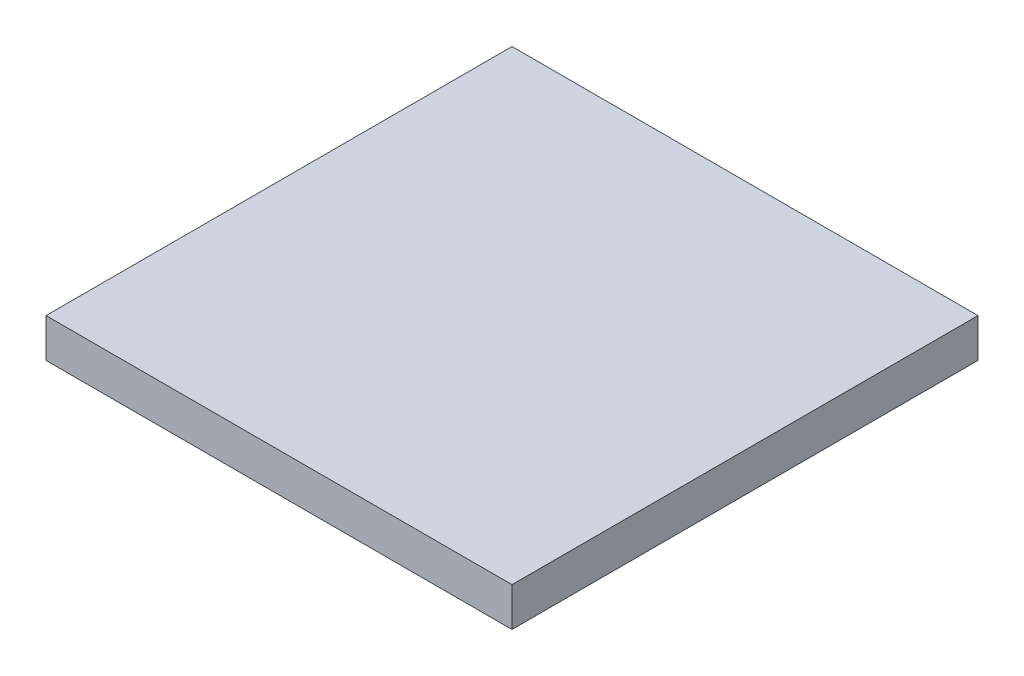
ISO-10303-21;
HEADER;
FILE_DESCRIPTION(('STEP AP214'),'2;1');
FILE_NAME('part.step','',(''),(''),'','','');
FILE_SCHEMA(('AUTOMOTIVE_DESIGN { 1 0 10303 214 1 1 1 1 }'));
ENDSEC;
DATA;
#1=APPLICATION_CONTEXT('core data for automotive mechanical design processes');
#2=APPLICATION_PROTOCOL_DEFINITION('international standard','automotive_design',2000,#1);
#3=PRODUCT_CONTEXT('',#1,'mechanical');
#4=PRODUCT('Part','Part','',(#3));
#5=PRODUCT_RELATED_PRODUCT_CATEGORY('part','',(#4));
#6=PRODUCT_DEFINITION_FORMATION('','',#4);
#7=PRODUCT_DEFINITION_CONTEXT('part definition',#1,'design');
#8=PRODUCT_DEFINITION('design','',#6,#7);
#9=PRODUCT_DEFINITION_SHAPE('','',#8);
#10=(LENGTH_UNIT() NAMED_UNIT(*) SI_UNIT(.MILLI.,.METRE.));
#11=(NAMED_UNIT(*) PLANE_ANGLE_UNIT() SI_UNIT($,.RADIAN.));
#12=(NAMED_UNIT(*) SI_UNIT($,.STERADIAN.) SOLID_ANGLE_UNIT());
#13=UNCERTAINTY_MEASURE_WITH_UNIT(LENGTH_MEASURE(1.E-05),#10,'distance_accuracy_value','');
#14=(GEOMETRIC_REPRESENTATION_CONTEXT(3) GLOBAL_UNCERTAINTY_ASSIGNED_CONTEXT((#13)) GLOBAL_UNIT_ASSIGNED_CONTEXT((#10,
#11,#12)) REPRESENTATION_CONTEXT('',''));
#15=CARTESIAN_POINT('',(0.,0.,0.));
#16=DIRECTION('',(0.,0.,1.));
#17=DIRECTION('',(1.,0.,0.));
#18=AXIS2_PLACEMENT_3D('',#15,#16,#17);
#19=CARTESIAN_POINT('',(19.05,3.175,19.05));
#20=DIRECTION('',(-1.,0.,0.));
#21=DIRECTION('',(0.,0.,1.));
#22=AXIS2_PLACEMENT_3D('',#19,#20,#21);
#23=PLANE('',#22);
#24=DIRECTION('',(0.,0.,-1.));
#25=VECTOR('',#24,1.);
#26=CARTESIAN_POINT('',(19.05,0.,19.05));
#27=LINE('',#26,#25);
#28=CARTESIAN_POINT('',(19.05,0.,19.05));
#29=VERTEX_POINT('',#28);
#30=CARTESIAN_POINT('',(19.05,0.,-19.05));
#31=VERTEX_POINT('',#30);
#32=EDGE_CURVE('E112',#29,#31,#27,.T.);
#33=ORIENTED_EDGE('',*,*,#32,.T.);
#34=DIRECTION('',(0.,-1.,0.));
#35=VECTOR('',#34,1.);
#36=CARTESIAN_POINT('',(19.05,3.175,-19.05));
#37=LINE('',#36,#35);
#38=CARTESIAN_POINT('',(19.05,3.175,-19.05));
#39=VERTEX_POINT('',#38);
#40=EDGE_CURVE('E11',#39,#31,#37,.T.);
#41=ORIENTED_EDGE('',*,*,#40,.F.);
#42=DIRECTION('',(0.,0.,-1.));
#43=VECTOR('',#42,1.);
#44=CARTESIAN_POINT('',(19.05,3.175,19.05));
#45=LINE('',#44,#43);
#46=CARTESIAN_POINT('',(19.05,3.175,19.05));
#47=VERTEX_POINT('',#46);
#48=EDGE_CURVE('E96',#47,#39,#45,.T.);
#49=ORIENTED_EDGE('',*,*,#48,.F.);
#50=DIRECTION('',(0.,-1.,0.));
#51=VECTOR('',#50,1.);
#52=CARTESIAN_POINT('',(19.05,3.175,19.05));
#53=LINE('',#52,#51);
#54=EDGE_CURVE('E108',#47,#29,#53,.T.);
#55=ORIENTED_EDGE('',*,*,#54,.T.);
#56=EDGE_LOOP('',(#33,#41,#49,#55));
#57=FACE_BOUND('',#56,.T.);
#58=ADVANCED_FACE('F44',(#57),#23,.F.);
#59=CARTESIAN_POINT('',(-19.05,3.175,-19.05));
#60=DIRECTION('',(0.,0.,1.));
#61=DIRECTION('',(1.,0.,0.));
#62=AXIS2_PLACEMENT_3D('',#59,#60,#61);
#63=PLANE('',#62);
#64=DIRECTION('',(-1.,0.,0.));
#65=VECTOR('',#64,1.);
#66=CARTESIAN_POINT('',(-19.05,0.,-19.05));
#67=LINE('',#66,#65);
#68=CARTESIAN_POINT('',(-19.05,0.,-19.05));
#69=VERTEX_POINT('',#68);
#70=EDGE_CURVE('E101',#31,#69,#67,.T.);
#71=ORIENTED_EDGE('',*,*,#70,.T.);
#72=DIRECTION('',(0.,-1.,0.));
#73=VECTOR('',#72,1.);
#74=CARTESIAN_POINT('',(-19.05,3.175,-19.05));
#75=LINE('',#74,#73);
#76=CARTESIAN_POINT('',(-19.05,3.175,-19.05));
#77=VERTEX_POINT('',#76);
#78=EDGE_CURVE('E53',#77,#69,#75,.T.);
#79=ORIENTED_EDGE('',*,*,#78,.F.);
#80=DIRECTION('',(-1.,0.,0.));
#81=VECTOR('',#80,1.);
#82=CARTESIAN_POINT('',(-19.05,3.175,-19.05));
#83=LINE('',#82,#81);
#84=EDGE_CURVE('E91',#39,#77,#83,.T.);
#85=ORIENTED_EDGE('',*,*,#84,.F.);
#86=ORIENTED_EDGE('',*,*,#40,.T.);
#87=EDGE_LOOP('',(#71,#79,#85,#86));
#88=FACE_BOUND('',#87,.T.);
#89=ADVANCED_FACE('F100',(#88),#63,.F.);
#90=CARTESIAN_POINT('',(-19.05,3.175,19.05));
#91=DIRECTION('',(1.,0.,0.));
#92=DIRECTION('',(0.,0.,-1.));
#93=AXIS2_PLACEMENT_3D('',#90,#91,#92);
#94=PLANE('',#93);
#95=DIRECTION('',(0.,0.,1.));
#96=VECTOR('',#95,1.);
#97=CARTESIAN_POINT('',(-19.05,0.,19.05));
#98=LINE('',#97,#96);
#99=CARTESIAN_POINT('',(-19.05,0.,19.05));
#100=VERTEX_POINT('',#99);
#101=EDGE_CURVE('E78',#69,#100,#98,.T.);
#102=ORIENTED_EDGE('',*,*,#101,.T.);
#103=DIRECTION('',(0.,-1.,0.));
#104=VECTOR('',#103,1.);
#105=CARTESIAN_POINT('',(-19.05,3.175,19.05));
#106=LINE('',#105,#104);
#107=CARTESIAN_POINT('',(-19.05,3.175,19.05));
#108=VERTEX_POINT('',#107);
#109=EDGE_CURVE('E103',#108,#100,#106,.T.);
#110=ORIENTED_EDGE('',*,*,#109,.F.);
#111=DIRECTION('',(0.,0.,1.));
#112=VECTOR('',#111,1.);
#113=CARTESIAN_POINT('',(-19.05,3.175,19.05));
#114=LINE('',#113,#112);
#115=EDGE_CURVE('E94',#77,#108,#114,.T.);
#116=ORIENTED_EDGE('',*,*,#115,.F.);
#117=ORIENTED_EDGE('',*,*,#78,.T.);
#118=EDGE_LOOP('',(#102,#110,#116,#117));
#119=FACE_BOUND('',#118,.T.);
#120=ADVANCED_FACE('F104',(#119),#94,.F.);
#121=CARTESIAN_POINT('',(-19.05,3.175,19.05));
#122=DIRECTION('',(0.,0.,-1.));
#123=DIRECTION('',(-1.,0.,0.));
#124=AXIS2_PLACEMENT_3D('',#121,#122,#123);
#125=PLANE('',#124);
#126=DIRECTION('',(1.,0.,0.));
#127=VECTOR('',#126,1.);
#128=CARTESIAN_POINT('',(-19.05,0.,19.05));
#129=LINE('',#128,#127);
#130=EDGE_CURVE('E84',#100,#29,#129,.T.);
#131=ORIENTED_EDGE('',*,*,#130,.T.);
#132=ORIENTED_EDGE('',*,*,#54,.F.);
#133=DIRECTION('',(1.,0.,0.));
#134=VECTOR('',#133,1.);
#135=CARTESIAN_POINT('',(-19.05,3.175,19.05));
#136=LINE('',#135,#134);
#137=EDGE_CURVE('E61',#108,#47,#136,.T.);
#138=ORIENTED_EDGE('',*,*,#137,.F.);
#139=ORIENTED_EDGE('',*,*,#109,.T.);
#140=EDGE_LOOP('',(#131,#132,#138,#139));
#141=FACE_BOUND('',#140,.T.);
#142=ADVANCED_FACE('F125',(#141),#125,.F.);
#143=CARTESIAN_POINT('',(0.,3.175,0.));
#144=DIRECTION('',(0.,-1.,0.));
#145=DIRECTION('',(0.,0.,-1.));
#146=AXIS2_PLACEMENT_3D('',#143,#144,#145);
#147=PLANE('',#146);
#148=ORIENTED_EDGE('',*,*,#48,.T.);
#149=ORIENTED_EDGE('',*,*,#84,.T.);
#150=ORIENTED_EDGE('',*,*,#115,.T.);
#151=ORIENTED_EDGE('',*,*,#137,.T.);
#152=EDGE_LOOP('',(#148,#149,#150,#151));
#153=FACE_BOUND('',#152,.T.);
#154=ADVANCED_FACE('F92',(#153),#147,.F.);
#155=CARTESIAN_POINT('',(0.,0.,0.));
#156=DIRECTION('',(0.,-1.,0.));
#157=DIRECTION('',(0.,0.,-1.));
#158=AXIS2_PLACEMENT_3D('',#155,#156,#157);
#159=PLANE('',#158);
#160=ORIENTED_EDGE('',*,*,#32,.F.);
#161=ORIENTED_EDGE('',*,*,#130,.F.);
#162=ORIENTED_EDGE('',*,*,#101,.F.);
#163=ORIENTED_EDGE('',*,*,#70,.F.);
#164=EDGE_LOOP('',(#160,#161,#162,#163));
#165=FACE_BOUND('',#164,.T.);
#166=ADVANCED_FACE('F128',(#165),#159,.T.);
#167=CLOSED_SHELL('',(#58,#89,#120,#142,#154,#166));
#168=MANIFOLD_SOLID_BREP('B2',#167);
#169=ADVANCED_BREP_SHAPE_REPRESENTATION('',(#18,#168),#14);
#170=SHAPE_DEFINITION_REPRESENTATION(#9,#169);
ENDSEC;
END-ISO-10303-21;
